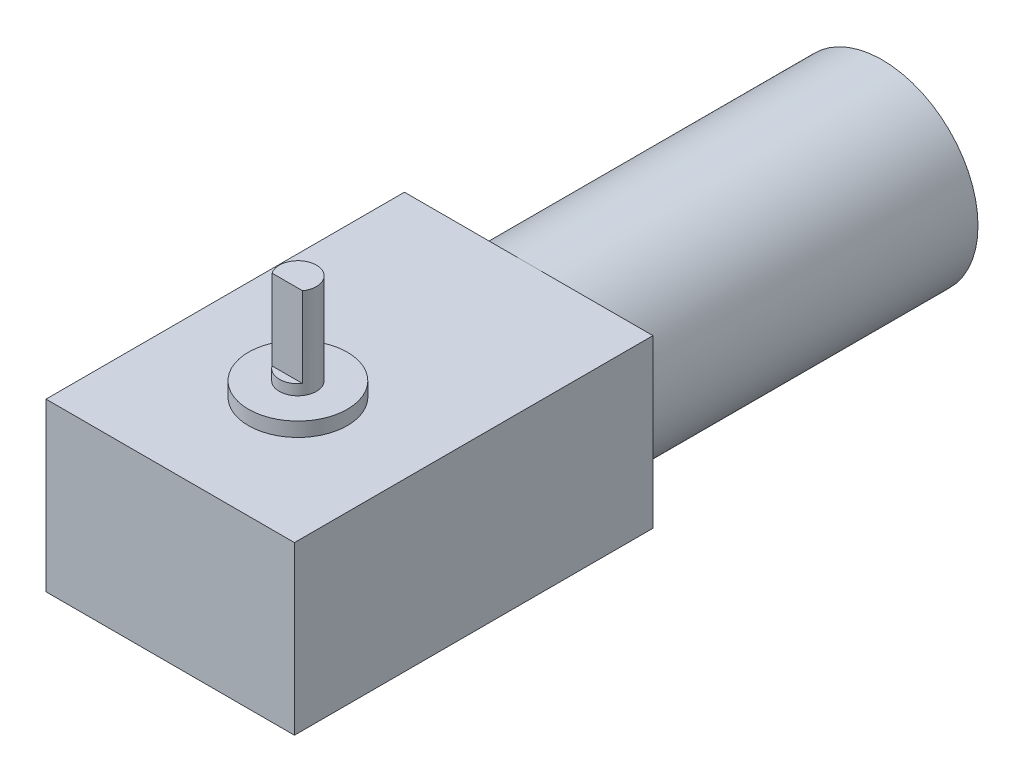
ISO-10303-21;
HEADER;
FILE_DESCRIPTION(('STEP AP214'),'2;1');
FILE_NAME('part.step','',(''),(''),'','','');
FILE_SCHEMA(('AUTOMOTIVE_DESIGN { 1 0 10303 214 1 1 1 1 }'));
ENDSEC;
DATA;
#1=APPLICATION_CONTEXT('core data for automotive mechanical design processes');
#2=APPLICATION_PROTOCOL_DEFINITION('international standard','automotive_design',2000,#1);
#3=PRODUCT_CONTEXT('',#1,'mechanical');
#4=PRODUCT('Part','Part','',(#3));
#5=PRODUCT_RELATED_PRODUCT_CATEGORY('part','',(#4));
#6=PRODUCT_DEFINITION_FORMATION('','',#4);
#7=PRODUCT_DEFINITION_CONTEXT('part definition',#1,'design');
#8=PRODUCT_DEFINITION('design','',#6,#7);
#9=PRODUCT_DEFINITION_SHAPE('','',#8);
#10=(LENGTH_UNIT() NAMED_UNIT(*) SI_UNIT(.MILLI.,.METRE.));
#11=(NAMED_UNIT(*) PLANE_ANGLE_UNIT() SI_UNIT($,.RADIAN.));
#12=(NAMED_UNIT(*) SI_UNIT($,.STERADIAN.) SOLID_ANGLE_UNIT());
#13=UNCERTAINTY_MEASURE_WITH_UNIT(LENGTH_MEASURE(1.E-05),#10,'distance_accuracy_value','');
#14=(GEOMETRIC_REPRESENTATION_CONTEXT(3) GLOBAL_UNCERTAINTY_ASSIGNED_CONTEXT((#13)) GLOBAL_UNIT_ASSIGNED_CONTEXT((#10,
#11,#12)) REPRESENTATION_CONTEXT('',''));
#15=CARTESIAN_POINT('',(0.,0.,0.));
#16=DIRECTION('',(0.,0.,1.));
#17=DIRECTION('',(1.,0.,0.));
#18=AXIS2_PLACEMENT_3D('',#15,#16,#17);
#19=CARTESIAN_POINT('',(0.,-11.5,115.2));
#20=DIRECTION('',(0.,1.,0.));
#21=DIRECTION('',(0.,0.,1.));
#22=AXIS2_PLACEMENT_3D('',#19,#20,#21);
#23=PLANE('',#22);
#24=CARTESIAN_POINT('',(-14.1,-11.5,66.2));
#25=DIRECTION('',(0.,1.,0.));
#26=DIRECTION('',(0.,0.,1.));
#27=AXIS2_PLACEMENT_3D('',#24,#25,#26);
#28=CIRCLE('',#27,3.5);
#29=CARTESIAN_POINT('',(-14.1,-11.5,69.7));
#30=VERTEX_POINT('',#29);
#31=EDGE_CURVE('E54',#30,#30,#28,.F.);
#32=ORIENTED_EDGE('',*,*,#31,.F.);
#33=EDGE_LOOP('',(#32));
#34=FACE_BOUND('',#33,.T.);
#35=CARTESIAN_POINT('',(14.1,-11.5,106.2));
#36=DIRECTION('',(0.,1.,0.));
#37=DIRECTION('',(0.,0.,1.));
#38=AXIS2_PLACEMENT_3D('',#35,#36,#37);
#39=CIRCLE('',#38,3.5);
#40=CARTESIAN_POINT('',(14.1,-11.5,109.7));
#41=VERTEX_POINT('',#40);
#42=EDGE_CURVE('E207',#41,#41,#39,.F.);
#43=ORIENTED_EDGE('',*,*,#42,.F.);
#44=EDGE_LOOP('',(#43));
#45=FACE_BOUND('',#44,.T.);
#46=CARTESIAN_POINT('',(0.,-11.5,95.2));
#47=DIRECTION('',(0.,1.,0.));
#48=DIRECTION('',(0.,0.,1.));
#49=AXIS2_PLACEMENT_3D('',#46,#47,#48);
#50=CIRCLE('',#49,9.25);
#51=CARTESIAN_POINT('',(0.,-11.5,104.45));
#52=VERTEX_POINT('',#51);
#53=EDGE_CURVE('E203',#52,#52,#50,.F.);
#54=ORIENTED_EDGE('',*,*,#53,.F.);
#55=EDGE_LOOP('',(#54));
#56=FACE_BOUND('',#55,.T.);
#57=DIRECTION('',(1.,0.,0.));
#58=VECTOR('',#57,1.);
#59=CARTESIAN_POINT('',(0.,-11.5,57.2));
#60=LINE('',#59,#58);
#61=CARTESIAN_POINT('',(-20.1,-11.5,57.2));
#62=VERTEX_POINT('',#61);
#63=CARTESIAN_POINT('',(-10.3923048454133,-11.5,57.2));
#64=VERTEX_POINT('',#63);
#65=EDGE_CURVE('E165',#62,#64,#60,.T.);
#66=ORIENTED_EDGE('',*,*,#65,.T.);
#67=CARTESIAN_POINT('',(10.3923048454133,-11.5,57.2));
#68=VERTEX_POINT('',#67);
#69=EDGE_CURVE('E68',#64,#68,#60,.T.);
#70=ORIENTED_EDGE('',*,*,#69,.T.);
#71=CARTESIAN_POINT('',(20.1,-11.5,57.2));
#72=VERTEX_POINT('',#71);
#73=EDGE_CURVE('E164',#68,#72,#60,.T.);
#74=ORIENTED_EDGE('',*,*,#73,.T.);
#75=DIRECTION('',(0.,0.,-1.));
#76=VECTOR('',#75,1.);
#77=CARTESIAN_POINT('',(20.1,-11.5,115.2));
#78=LINE('',#77,#76);
#79=CARTESIAN_POINT('',(20.1,-11.5,115.2));
#80=VERTEX_POINT('',#79);
#81=EDGE_CURVE('E183',#80,#72,#78,.T.);
#82=ORIENTED_EDGE('',*,*,#81,.F.);
#83=DIRECTION('',(1.,0.,0.));
#84=VECTOR('',#83,1.);
#85=CARTESIAN_POINT('',(0.,-11.5,115.2));
#86=LINE('',#85,#84);
#87=CARTESIAN_POINT('',(-20.1,-11.5,115.2));
#88=VERTEX_POINT('',#87);
#89=EDGE_CURVE('E148',#88,#80,#86,.T.);
#90=ORIENTED_EDGE('',*,*,#89,.F.);
#91=DIRECTION('',(0.,0.,-1.));
#92=VECTOR('',#91,1.);
#93=CARTESIAN_POINT('',(-20.1,-11.5,115.2));
#94=LINE('',#93,#92);
#95=EDGE_CURVE('E187',#88,#62,#94,.T.);
#96=ORIENTED_EDGE('',*,*,#95,.T.);
#97=EDGE_LOOP('',(#66,#70,#74,#82,#90,#96));
#98=FACE_BOUND('',#97,.T.);
#99=CARTESIAN_POINT('',(14.1,-11.5,66.2));
#100=DIRECTION('',(0.,1.,0.));
#101=DIRECTION('',(0.,0.,1.));
#102=AXIS2_PLACEMENT_3D('',#99,#100,#101);
#103=CIRCLE('',#102,3.5);
#104=CARTESIAN_POINT('',(14.1,-11.5,69.7));
#105=VERTEX_POINT('',#104);
#106=EDGE_CURVE('E211',#105,#105,#103,.F.);
#107=ORIENTED_EDGE('',*,*,#106,.F.);
#108=EDGE_LOOP('',(#107));
#109=FACE_BOUND('',#108,.T.);
#110=CARTESIAN_POINT('',(-14.1,-11.5,106.2));
#111=DIRECTION('',(0.,1.,0.));
#112=DIRECTION('',(0.,0.,1.));
#113=AXIS2_PLACEMENT_3D('',#110,#111,#112);
#114=CIRCLE('',#113,3.5);
#115=CARTESIAN_POINT('',(-14.1,-11.5,109.7));
#116=VERTEX_POINT('',#115);
#117=EDGE_CURVE('E11',#116,#116,#114,.F.);
#118=ORIENTED_EDGE('',*,*,#117,.F.);
#119=EDGE_LOOP('',(#118));
#120=FACE_BOUND('',#119,.T.);
#121=ADVANCED_FACE('F45',(#34,#45,#56,#98,#109,#120),#23,.F.);
#122=CARTESIAN_POINT('',(0.,0.,57.2));
#123=DIRECTION('',(0.,0.,-1.));
#124=DIRECTION('',(-1.,0.,0.));
#125=AXIS2_PLACEMENT_3D('',#122,#123,#124);
#126=CYLINDRICAL_SURFACE('',#125,15.5);
#127=CARTESIAN_POINT('',(0.,0.,57.2));
#128=DIRECTION('',(0.,0.,1.));
#129=DIRECTION('',(1.,0.,0.));
#130=AXIS2_PLACEMENT_3D('',#127,#128,#129);
#131=CIRCLE('',#130,15.5);
#132=CARTESIAN_POINT('',(0.,15.5,57.2));
#133=VERTEX_POINT('',#132);
#134=EDGE_CURVE('E192',#133,#64,#131,.T.);
#135=ORIENTED_EDGE('',*,*,#134,.F.);
#136=EDGE_CURVE('E197',#68,#133,#131,.T.);
#137=ORIENTED_EDGE('',*,*,#136,.F.);
#138=EDGE_CURVE('E196',#64,#68,#131,.T.);
#139=ORIENTED_EDGE('',*,*,#138,.F.);
#140=EDGE_LOOP('',(#135,#137,#139));
#141=FACE_BOUND('',#140,.T.);
#142=CARTESIAN_POINT('',(0.,0.,0.));
#143=DIRECTION('',(0.,0.,1.));
#144=DIRECTION('',(1.,0.,0.));
#145=AXIS2_PLACEMENT_3D('',#142,#143,#144);
#146=CIRCLE('',#145,15.5);
#147=CARTESIAN_POINT('',(15.5,0.,0.));
#148=VERTEX_POINT('',#147);
#149=EDGE_CURVE('E191',#148,#148,#146,.T.);
#150=ORIENTED_EDGE('',*,*,#149,.T.);
#151=EDGE_LOOP('',(#150));
#152=FACE_BOUND('',#151,.T.);
#153=ADVANCED_FACE('F47',(#141,#152),#126,.T.);
#154=CARTESIAN_POINT('',(0.,0.,57.2));
#155=DIRECTION('',(0.,0.,1.));
#156=DIRECTION('',(1.,0.,0.));
#157=AXIS2_PLACEMENT_3D('',#154,#155,#156);
#158=PLANE('',#157);
#159=ORIENTED_EDGE('',*,*,#69,.F.);
#160=ORIENTED_EDGE('',*,*,#138,.T.);
#161=EDGE_LOOP('',(#159,#160));
#162=FACE_BOUND('',#161,.T.);
#163=ADVANCED_FACE('F347',(#162),#158,.T.);
#164=CARTESIAN_POINT('',(0.,0.,0.));
#165=DIRECTION('',(0.,0.,1.));
#166=DIRECTION('',(1.,0.,0.));
#167=AXIS2_PLACEMENT_3D('',#164,#165,#166);
#168=PLANE('',#167);
#169=ORIENTED_EDGE('',*,*,#149,.F.);
#170=EDGE_LOOP('',(#169));
#171=FACE_BOUND('',#170,.T.);
#172=ADVANCED_FACE('F334',(#171),#168,.F.);
#173=CARTESIAN_POINT('',(0.,0.,57.2));
#174=DIRECTION('',(0.,0.,1.));
#175=DIRECTION('',(1.,0.,0.));
#176=AXIS2_PLACEMENT_3D('',#173,#174,#175);
#177=PLANE('',#176);
#178=DIRECTION('',(1.,0.,0.));
#179=VECTOR('',#178,1.);
#180=CARTESIAN_POINT('',(0.,15.5,57.2));
#181=LINE('',#180,#179);
#182=CARTESIAN_POINT('',(-20.1,15.5,57.2));
#183=VERTEX_POINT('',#182);
#184=EDGE_CURVE('E149',#183,#133,#181,.T.);
#185=ORIENTED_EDGE('',*,*,#184,.T.);
#186=ORIENTED_EDGE('',*,*,#134,.T.);
#187=ORIENTED_EDGE('',*,*,#65,.F.);
#188=DIRECTION('',(0.,-1.,0.));
#189=VECTOR('',#188,1.);
#190=CARTESIAN_POINT('',(-20.1,0.,57.2));
#191=LINE('',#190,#189);
#192=EDGE_CURVE('E142',#183,#62,#191,.T.);
#193=ORIENTED_EDGE('',*,*,#192,.F.);
#194=EDGE_LOOP('',(#185,#186,#187,#193));
#195=FACE_BOUND('',#194,.T.);
#196=ADVANCED_FACE('F330',(#195),#177,.F.);
#197=ORIENTED_EDGE('',*,*,#73,.F.);
#198=ORIENTED_EDGE('',*,*,#136,.T.);
#199=CARTESIAN_POINT('',(20.1,15.5,57.2));
#200=VERTEX_POINT('',#199);
#201=EDGE_CURVE('E173',#133,#200,#181,.T.);
#202=ORIENTED_EDGE('',*,*,#201,.T.);
#203=DIRECTION('',(0.,-1.,0.));
#204=VECTOR('',#203,1.);
#205=CARTESIAN_POINT('',(20.1,0.,57.2));
#206=LINE('',#205,#204);
#207=EDGE_CURVE('E169',#200,#72,#206,.T.);
#208=ORIENTED_EDGE('',*,*,#207,.T.);
#209=EDGE_LOOP('',(#197,#198,#202,#208));
#210=FACE_BOUND('',#209,.T.);
#211=ADVANCED_FACE('F333',(#210),#177,.F.);
#212=CARTESIAN_POINT('',(-20.1,0.,115.2));
#213=DIRECTION('',(1.,0.,0.));
#214=DIRECTION('',(0.,1.,0.));
#215=AXIS2_PLACEMENT_3D('',#212,#213,#214);
#216=PLANE('',#215);
#217=ORIENTED_EDGE('',*,*,#192,.T.);
#218=ORIENTED_EDGE('',*,*,#95,.F.);
#219=DIRECTION('',(0.,-1.,0.));
#220=VECTOR('',#219,1.);
#221=CARTESIAN_POINT('',(-20.1,0.,115.2));
#222=LINE('',#221,#220);
#223=CARTESIAN_POINT('',(-20.1,15.5,115.2));
#224=VERTEX_POINT('',#223);
#225=EDGE_CURVE('E144',#224,#88,#222,.T.);
#226=ORIENTED_EDGE('',*,*,#225,.F.);
#227=DIRECTION('',(0.,0.,-1.));
#228=VECTOR('',#227,1.);
#229=CARTESIAN_POINT('',(-20.1,15.5,115.2));
#230=LINE('',#229,#228);
#231=EDGE_CURVE('E160',#224,#183,#230,.T.);
#232=ORIENTED_EDGE('',*,*,#231,.T.);
#233=EDGE_LOOP('',(#217,#218,#226,#232));
#234=FACE_BOUND('',#233,.T.);
#235=ADVANCED_FACE('F341',(#234),#216,.F.);
#236=CARTESIAN_POINT('',(20.1,0.,115.2));
#237=DIRECTION('',(1.,0.,0.));
#238=DIRECTION('',(0.,1.,0.));
#239=AXIS2_PLACEMENT_3D('',#236,#237,#238);
#240=PLANE('',#239);
#241=ORIENTED_EDGE('',*,*,#207,.F.);
#242=DIRECTION('',(0.,0.,-1.));
#243=VECTOR('',#242,1.);
#244=CARTESIAN_POINT('',(20.1,15.5,115.2));
#245=LINE('',#244,#243);
#246=CARTESIAN_POINT('',(20.1,15.5,115.2));
#247=VERTEX_POINT('',#246);
#248=EDGE_CURVE('E179',#247,#200,#245,.T.);
#249=ORIENTED_EDGE('',*,*,#248,.F.);
#250=DIRECTION('',(0.,-1.,0.));
#251=VECTOR('',#250,1.);
#252=CARTESIAN_POINT('',(20.1,0.,115.2));
#253=LINE('',#252,#251);
#254=EDGE_CURVE('E152',#247,#80,#253,.T.);
#255=ORIENTED_EDGE('',*,*,#254,.T.);
#256=ORIENTED_EDGE('',*,*,#81,.T.);
#257=EDGE_LOOP('',(#241,#249,#255,#256));
#258=FACE_BOUND('',#257,.T.);
#259=ADVANCED_FACE('F338',(#258),#240,.T.);
#260=CARTESIAN_POINT('',(0.,15.5,115.2));
#261=DIRECTION('',(0.,1.,0.));
#262=DIRECTION('',(0.,0.,1.));
#263=AXIS2_PLACEMENT_3D('',#260,#261,#262);
#264=PLANE('',#263);
#265=CARTESIAN_POINT('',(0.,15.5,94.5405519584882));
#266=DIRECTION('',(0.,1.,0.));
#267=DIRECTION('',(0.,0.,1.));
#268=AXIS2_PLACEMENT_3D('',#265,#266,#267);
#269=CIRCLE('',#268,8.);
#270=CARTESIAN_POINT('',(0.,15.5,102.540551958488));
#271=VERTEX_POINT('',#270);
#272=EDGE_CURVE('E128',#271,#271,#269,.T.);
#273=ORIENTED_EDGE('',*,*,#272,.F.);
#274=EDGE_LOOP('',(#273));
#275=FACE_BOUND('',#274,.T.);
#276=ORIENTED_EDGE('',*,*,#184,.F.);
#277=ORIENTED_EDGE('',*,*,#231,.F.);
#278=DIRECTION('',(1.,0.,0.));
#279=VECTOR('',#278,1.);
#280=CARTESIAN_POINT('',(0.,15.5,115.2));
#281=LINE('',#280,#279);
#282=EDGE_CURVE('E156',#224,#247,#281,.T.);
#283=ORIENTED_EDGE('',*,*,#282,.T.);
#284=ORIENTED_EDGE('',*,*,#248,.T.);
#285=ORIENTED_EDGE('',*,*,#201,.F.);
#286=EDGE_LOOP('',(#276,#277,#283,#284,#285));
#287=FACE_BOUND('',#286,.T.);
#288=ADVANCED_FACE('F328',(#275,#287),#264,.T.);
#289=CARTESIAN_POINT('',(0.,0.,115.2));
#290=DIRECTION('',(0.,0.,1.));
#291=DIRECTION('',(1.,0.,0.));
#292=AXIS2_PLACEMENT_3D('',#289,#290,#291);
#293=PLANE('',#292);
#294=ORIENTED_EDGE('',*,*,#225,.T.);
#295=ORIENTED_EDGE('',*,*,#89,.T.);
#296=ORIENTED_EDGE('',*,*,#254,.F.);
#297=ORIENTED_EDGE('',*,*,#282,.F.);
#298=EDGE_LOOP('',(#294,#295,#296,#297));
#299=FACE_BOUND('',#298,.T.);
#300=ADVANCED_FACE('F324',(#299),#293,.T.);
#301=CARTESIAN_POINT('',(0.,17.8,94.5405519584882));
#302=DIRECTION('',(0.,-1.,0.));
#303=DIRECTION('',(0.,0.,-1.));
#304=AXIS2_PLACEMENT_3D('',#301,#302,#303);
#305=CYLINDRICAL_SURFACE('',#304,8.);
#306=CARTESIAN_POINT('',(0.,17.8,94.5405519584882));
#307=DIRECTION('',(0.,1.,0.));
#308=DIRECTION('',(0.,0.,1.));
#309=AXIS2_PLACEMENT_3D('',#306,#307,#308);
#310=CIRCLE('',#309,8.);
#311=CARTESIAN_POINT('',(0.,17.8,102.540551958488));
#312=VERTEX_POINT('',#311);
#313=EDGE_CURVE('E133',#312,#312,#310,.T.);
#314=ORIENTED_EDGE('',*,*,#313,.F.);
#315=EDGE_LOOP('',(#314));
#316=FACE_BOUND('',#315,.T.);
#317=ORIENTED_EDGE('',*,*,#272,.T.);
#318=EDGE_LOOP('',(#317));
#319=FACE_BOUND('',#318,.T.);
#320=ADVANCED_FACE('F320',(#316,#319),#305,.T.);
#321=CARTESIAN_POINT('',(0.,17.8,94.5405519584882));
#322=DIRECTION('',(0.,1.,0.));
#323=DIRECTION('',(0.,0.,1.));
#324=AXIS2_PLACEMENT_3D('',#321,#322,#323);
#325=PLANE('',#324);
#326=CARTESIAN_POINT('',(0.,17.8,94.5405519584882));
#327=DIRECTION('',(0.,1.,0.));
#328=DIRECTION('',(0.,0.,1.));
#329=AXIS2_PLACEMENT_3D('',#326,#327,#328);
#330=CIRCLE('',#329,3.);
#331=CARTESIAN_POINT('',(0.,17.8,97.5405519584882));
#332=VERTEX_POINT('',#331);
#333=EDGE_CURVE('E116',#332,#332,#330,.T.);
#334=ORIENTED_EDGE('',*,*,#333,.F.);
#335=EDGE_LOOP('',(#334));
#336=FACE_BOUND('',#335,.T.);
#337=ORIENTED_EDGE('',*,*,#313,.T.);
#338=EDGE_LOOP('',(#337));
#339=FACE_BOUND('',#338,.T.);
#340=ADVANCED_FACE('F317',(#336,#339),#325,.T.);
#341=CARTESIAN_POINT('',(0.,32.5,94.5405519584882));
#342=DIRECTION('',(0.,-1.,0.));
#343=DIRECTION('',(0.,0.,-1.));
#344=AXIS2_PLACEMENT_3D('',#341,#342,#343);
#345=CYLINDRICAL_SURFACE('',#344,3.);
#346=CARTESIAN_POINT('',(0.,32.5,94.5405519584882));
#347=DIRECTION('',(0.,1.,0.));
#348=DIRECTION('',(0.,0.,1.));
#349=AXIS2_PLACEMENT_3D('',#346,#347,#348);
#350=CIRCLE('',#349,3.);
#351=CARTESIAN_POINT('',(2.46082368507366,32.5,96.2564618602548));
#352=VERTEX_POINT('',#351);
#353=CARTESIAN_POINT('',(-2.46082368507366,32.5,96.2564618602548));
#354=VERTEX_POINT('',#353);
#355=EDGE_CURVE('E122',#352,#354,#350,.T.);
#356=ORIENTED_EDGE('',*,*,#355,.F.);
#357=DIRECTION('',(0.,-1.,0.));
#358=VECTOR('',#357,1.);
#359=CARTESIAN_POINT('',(2.46082368507366,32.5,96.2564618602548));
#360=LINE('',#359,#358);
#361=CARTESIAN_POINT('',(2.46082368507366,19.5,96.2564618602548));
#362=VERTEX_POINT('',#361);
#363=EDGE_CURVE('E61',#352,#362,#360,.T.);
#364=ORIENTED_EDGE('',*,*,#363,.T.);
#365=CARTESIAN_POINT('',(0.,19.5,94.5405519584882));
#366=DIRECTION('',(0.,-1.,0.));
#367=DIRECTION('',(0.,0.,-1.));
#368=AXIS2_PLACEMENT_3D('',#365,#366,#367);
#369=CIRCLE('',#368,3.);
#370=CARTESIAN_POINT('',(-2.46082368507366,19.5,96.2564618602548));
#371=VERTEX_POINT('',#370);
#372=EDGE_CURVE('E115',#362,#371,#369,.T.);
#373=ORIENTED_EDGE('',*,*,#372,.T.);
#374=DIRECTION('',(0.,-1.,0.));
#375=VECTOR('',#374,1.);
#376=CARTESIAN_POINT('',(-2.46082368507366,32.5,96.2564618602548));
#377=LINE('',#376,#375);
#378=EDGE_CURVE('E109',#371,#354,#377,.F.);
#379=ORIENTED_EDGE('',*,*,#378,.T.);
#380=EDGE_LOOP('',(#356,#364,#373,#379));
#381=FACE_BOUND('',#380,.T.);
#382=ORIENTED_EDGE('',*,*,#333,.T.);
#383=EDGE_LOOP('',(#382));
#384=FACE_BOUND('',#383,.T.);
#385=ADVANCED_FACE('F120',(#381,#384),#345,.T.);
#386=CARTESIAN_POINT('',(0.,32.5,94.5405519584882));
#387=DIRECTION('',(0.,1.,0.));
#388=DIRECTION('',(0.,0.,1.));
#389=AXIS2_PLACEMENT_3D('',#386,#387,#388);
#390=PLANE('',#389);
#391=DIRECTION('',(-1.,0.,0.));
#392=VECTOR('',#391,1.);
#393=CARTESIAN_POINT('',(0.,32.5,96.2564618602548));
#394=LINE('',#393,#392);
#395=EDGE_CURVE('E106',#352,#354,#394,.T.);
#396=ORIENTED_EDGE('',*,*,#395,.F.);
#397=ORIENTED_EDGE('',*,*,#355,.T.);
#398=EDGE_LOOP('',(#396,#397));
#399=FACE_BOUND('',#398,.T.);
#400=ADVANCED_FACE('F126',(#399),#390,.T.);
#401=CARTESIAN_POINT('',(0.,19.5,0.));
#402=DIRECTION('',(0.,-1.,0.));
#403=DIRECTION('',(0.,0.,-1.));
#404=AXIS2_PLACEMENT_3D('',#401,#402,#403);
#405=PLANE('',#404);
#406=DIRECTION('',(-1.,0.,0.));
#407=VECTOR('',#406,1.);
#408=CARTESIAN_POINT('',(-3.21787522908284,19.5,96.2564618602548));
#409=LINE('',#408,#407);
#410=EDGE_CURVE('E124',#362,#371,#409,.T.);
#411=ORIENTED_EDGE('',*,*,#410,.T.);
#412=ORIENTED_EDGE('',*,*,#372,.F.);
#413=EDGE_LOOP('',(#411,#412));
#414=FACE_BOUND('',#413,.T.);
#415=ADVANCED_FACE('F307',(#414),#405,.F.);
#416=CARTESIAN_POINT('',(-3.21787522908284,19.5,96.2564618602548));
#417=DIRECTION('',(0.,0.,-1.));
#418=DIRECTION('',(-1.,0.,0.));
#419=AXIS2_PLACEMENT_3D('',#416,#417,#418);
#420=PLANE('',#419);
#421=ORIENTED_EDGE('',*,*,#395,.T.);
#422=ORIENTED_EDGE('',*,*,#378,.F.);
#423=ORIENTED_EDGE('',*,*,#410,.F.);
#424=ORIENTED_EDGE('',*,*,#363,.F.);
#425=EDGE_LOOP('',(#421,#422,#423,#424));
#426=FACE_BOUND('',#425,.T.);
#427=ADVANCED_FACE('F108',(#426),#420,.F.);
#428=CARTESIAN_POINT('',(0.,-16.,95.2));
#429=DIRECTION('',(0.,1.,0.));
#430=DIRECTION('',(0.,0.,1.));
#431=AXIS2_PLACEMENT_3D('',#428,#429,#430);
#432=CYLINDRICAL_SURFACE('',#431,9.25);
#433=CARTESIAN_POINT('',(0.,-16.,95.2));
#434=DIRECTION('',(0.,-1.,0.));
#435=DIRECTION('',(0.,0.,-1.));
#436=AXIS2_PLACEMENT_3D('',#433,#434,#435);
#437=CIRCLE('',#436,9.25);
#438=CARTESIAN_POINT('',(0.,-16.,85.95));
#439=VERTEX_POINT('',#438);
#440=EDGE_CURVE('E625',#439,#439,#437,.T.);
#441=ORIENTED_EDGE('',*,*,#440,.F.);
#442=EDGE_LOOP('',(#441));
#443=FACE_BOUND('',#442,.T.);
#444=ORIENTED_EDGE('',*,*,#53,.T.);
#445=EDGE_LOOP('',(#444));
#446=FACE_BOUND('',#445,.T.);
#447=ADVANCED_FACE('F282',(#443,#446),#432,.T.);
#448=CARTESIAN_POINT('',(0.,-16.,95.2));
#449=DIRECTION('',(0.,-1.,0.));
#450=DIRECTION('',(0.,0.,-1.));
#451=AXIS2_PLACEMENT_3D('',#448,#449,#450);
#452=PLANE('',#451);
#453=ORIENTED_EDGE('',*,*,#440,.T.);
#454=EDGE_LOOP('',(#453));
#455=FACE_BOUND('',#454,.T.);
#456=ADVANCED_FACE('F274',(#455),#452,.T.);
#457=CARTESIAN_POINT('',(14.1,-13.5,106.2));
#458=DIRECTION('',(0.,-1.,0.));
#459=DIRECTION('',(0.,0.,-1.));
#460=AXIS2_PLACEMENT_3D('',#457,#458,#459);
#461=PLANE('',#460);
#462=CARTESIAN_POINT('',(14.1,-13.5,106.2));
#463=DIRECTION('',(0.,-1.,0.));
#464=DIRECTION('',(0.,0.,-1.));
#465=AXIS2_PLACEMENT_3D('',#462,#463,#464);
#466=CIRCLE('',#465,3.5);
#467=CARTESIAN_POINT('',(14.1,-13.5,102.7));
#468=VERTEX_POINT('',#467);
#469=EDGE_CURVE('E635',#468,#468,#466,.T.);
#470=ORIENTED_EDGE('',*,*,#469,.T.);
#471=EDGE_LOOP('',(#470));
#472=FACE_BOUND('',#471,.T.);
#473=CARTESIAN_POINT('',(14.1,-13.5,106.2));
#474=DIRECTION('',(0.,-1.,0.));
#475=DIRECTION('',(0.,0.,-1.));
#476=AXIS2_PLACEMENT_3D('',#473,#474,#475);
#477=CIRCLE('',#476,2.);
#478=CARTESIAN_POINT('',(14.1,-13.5,104.2));
#479=VERTEX_POINT('',#478);
#480=EDGE_CURVE('E639',#479,#479,#477,.T.);
#481=ORIENTED_EDGE('',*,*,#480,.F.);
#482=EDGE_LOOP('',(#481));
#483=FACE_BOUND('',#482,.T.);
#484=ADVANCED_FACE('F270',(#472,#483),#461,.T.);
#485=CARTESIAN_POINT('',(14.1,-13.5,106.2));
#486=DIRECTION('',(0.,1.,0.));
#487=DIRECTION('',(0.,0.,1.));
#488=AXIS2_PLACEMENT_3D('',#485,#486,#487);
#489=CYLINDRICAL_SURFACE('',#488,3.5);
#490=ORIENTED_EDGE('',*,*,#469,.F.);
#491=EDGE_LOOP('',(#490));
#492=FACE_BOUND('',#491,.T.);
#493=ORIENTED_EDGE('',*,*,#42,.T.);
#494=EDGE_LOOP('',(#493));
#495=FACE_BOUND('',#494,.T.);
#496=ADVANCED_FACE('F273',(#492,#495),#489,.T.);
#497=CARTESIAN_POINT('',(14.1,-4.5,106.2));
#498=DIRECTION('',(0.,-1.,0.));
#499=DIRECTION('',(0.,0.,-1.));
#500=AXIS2_PLACEMENT_3D('',#497,#498,#499);
#501=PLANE('',#500);
#502=CARTESIAN_POINT('',(14.1,-4.5,106.2));
#503=DIRECTION('',(0.,-1.,0.));
#504=DIRECTION('',(0.,0.,-1.));
#505=AXIS2_PLACEMENT_3D('',#502,#503,#504);
#506=CIRCLE('',#505,2.);
#507=CARTESIAN_POINT('',(14.1,-4.5,104.2));
#508=VERTEX_POINT('',#507);
#509=EDGE_CURVE('E613',#508,#508,#506,.T.);
#510=ORIENTED_EDGE('',*,*,#509,.T.);
#511=EDGE_LOOP('',(#510));
#512=FACE_BOUND('',#511,.T.);
#513=ADVANCED_FACE('F278',(#512),#501,.T.);
#514=CARTESIAN_POINT('',(14.1,-4.5,106.2));
#515=DIRECTION('',(0.,-1.,0.));
#516=DIRECTION('',(0.,0.,-1.));
#517=AXIS2_PLACEMENT_3D('',#514,#515,#516);
#518=CYLINDRICAL_SURFACE('',#517,2.);
#519=ORIENTED_EDGE('',*,*,#509,.F.);
#520=EDGE_LOOP('',(#519));
#521=FACE_BOUND('',#520,.T.);
#522=ORIENTED_EDGE('',*,*,#480,.T.);
#523=EDGE_LOOP('',(#522));
#524=FACE_BOUND('',#523,.T.);
#525=ADVANCED_FACE('F268',(#521,#524),#518,.F.);
#526=CARTESIAN_POINT('',(14.1,-13.5,66.2));
#527=DIRECTION('',(0.,-1.,0.));
#528=DIRECTION('',(0.,0.,-1.));
#529=AXIS2_PLACEMENT_3D('',#526,#527,#528);
#530=PLANE('',#529);
#531=CARTESIAN_POINT('',(14.1,-13.5,66.2));
#532=DIRECTION('',(0.,-1.,0.));
#533=DIRECTION('',(0.,0.,-1.));
#534=AXIS2_PLACEMENT_3D('',#531,#532,#533);
#535=CIRCLE('',#534,3.5);
#536=CARTESIAN_POINT('',(14.1,-13.5,62.7));
#537=VERTEX_POINT('',#536);
#538=EDGE_CURVE('E647',#537,#537,#535,.T.);
#539=ORIENTED_EDGE('',*,*,#538,.T.);
#540=EDGE_LOOP('',(#539));
#541=FACE_BOUND('',#540,.T.);
#542=CARTESIAN_POINT('',(14.1,-13.5,66.2));
#543=DIRECTION('',(0.,-1.,0.));
#544=DIRECTION('',(0.,0.,-1.));
#545=AXIS2_PLACEMENT_3D('',#542,#543,#544);
#546=CIRCLE('',#545,2.);
#547=CARTESIAN_POINT('',(14.1,-13.5,64.2));
#548=VERTEX_POINT('',#547);
#549=EDGE_CURVE('E643',#548,#548,#546,.T.);
#550=ORIENTED_EDGE('',*,*,#549,.F.);
#551=EDGE_LOOP('',(#550));
#552=FACE_BOUND('',#551,.T.);
#553=ADVANCED_FACE('F264',(#541,#552),#530,.T.);
#554=CARTESIAN_POINT('',(14.1,-13.5,66.2));
#555=DIRECTION('',(0.,1.,0.));
#556=DIRECTION('',(0.,0.,1.));
#557=AXIS2_PLACEMENT_3D('',#554,#555,#556);
#558=CYLINDRICAL_SURFACE('',#557,3.5);
#559=ORIENTED_EDGE('',*,*,#538,.F.);
#560=EDGE_LOOP('',(#559));
#561=FACE_BOUND('',#560,.T.);
#562=ORIENTED_EDGE('',*,*,#106,.T.);
#563=EDGE_LOOP('',(#562));
#564=FACE_BOUND('',#563,.T.);
#565=ADVANCED_FACE('F260',(#561,#564),#558,.T.);
#566=CARTESIAN_POINT('',(14.1,-4.5,66.2));
#567=DIRECTION('',(0.,1.,0.));
#568=DIRECTION('',(0.,0.,1.));
#569=AXIS2_PLACEMENT_3D('',#566,#567,#568);
#570=PLANE('',#569);
#571=CARTESIAN_POINT('',(14.1,-4.5,66.2));
#572=DIRECTION('',(0.,-1.,0.));
#573=DIRECTION('',(0.,0.,1.));
#574=AXIS2_PLACEMENT_3D('',#571,#572,#573);
#575=CIRCLE('',#574,2.);
#576=CARTESIAN_POINT('',(14.1,-4.5,68.2));
#577=VERTEX_POINT('',#576);
#578=EDGE_CURVE('E617',#577,#577,#575,.T.);
#579=ORIENTED_EDGE('',*,*,#578,.T.);
#580=EDGE_LOOP('',(#579));
#581=FACE_BOUND('',#580,.T.);
#582=ADVANCED_FACE('F263',(#581),#570,.F.);
#583=CARTESIAN_POINT('',(14.1,-4.5,66.2));
#584=DIRECTION('',(0.,-1.,0.));
#585=DIRECTION('',(0.,0.,-1.));
#586=AXIS2_PLACEMENT_3D('',#583,#584,#585);
#587=CYLINDRICAL_SURFACE('',#586,2.);
#588=ORIENTED_EDGE('',*,*,#578,.F.);
#589=EDGE_LOOP('',(#588));
#590=FACE_BOUND('',#589,.T.);
#591=ORIENTED_EDGE('',*,*,#549,.T.);
#592=EDGE_LOOP('',(#591));
#593=FACE_BOUND('',#592,.T.);
#594=ADVANCED_FACE('F258',(#590,#593),#587,.F.);
#595=CARTESIAN_POINT('',(-14.1,-13.5,66.2));
#596=DIRECTION('',(0.,-1.,0.));
#597=DIRECTION('',(0.,0.,-1.));
#598=AXIS2_PLACEMENT_3D('',#595,#596,#597);
#599=PLANE('',#598);
#600=CARTESIAN_POINT('',(-14.1,-13.5,66.2));
#601=DIRECTION('',(0.,-1.,0.));
#602=DIRECTION('',(0.,0.,-1.));
#603=AXIS2_PLACEMENT_3D('',#600,#601,#602);
#604=CIRCLE('',#603,3.5);
#605=CARTESIAN_POINT('',(-14.1,-13.5,62.7));
#606=VERTEX_POINT('',#605);
#607=EDGE_CURVE('E655',#606,#606,#604,.T.);
#608=ORIENTED_EDGE('',*,*,#607,.T.);
#609=EDGE_LOOP('',(#608));
#610=FACE_BOUND('',#609,.T.);
#611=CARTESIAN_POINT('',(-14.1,-13.5,66.2));
#612=DIRECTION('',(0.,-1.,0.));
#613=DIRECTION('',(0.,0.,-1.));
#614=AXIS2_PLACEMENT_3D('',#611,#612,#613);
#615=CIRCLE('',#614,2.);
#616=CARTESIAN_POINT('',(-14.1,-13.5,64.2));
#617=VERTEX_POINT('',#616);
#618=EDGE_CURVE('E651',#617,#617,#615,.T.);
#619=ORIENTED_EDGE('',*,*,#618,.F.);
#620=EDGE_LOOP('',(#619));
#621=FACE_BOUND('',#620,.T.);
#622=ADVANCED_FACE('F254',(#610,#621),#599,.T.);
#623=CARTESIAN_POINT('',(-14.1,-13.5,66.2));
#624=DIRECTION('',(0.,1.,0.));
#625=DIRECTION('',(0.,0.,1.));
#626=AXIS2_PLACEMENT_3D('',#623,#624,#625);
#627=CYLINDRICAL_SURFACE('',#626,3.5);
#628=ORIENTED_EDGE('',*,*,#607,.F.);
#629=EDGE_LOOP('',(#628));
#630=FACE_BOUND('',#629,.T.);
#631=ORIENTED_EDGE('',*,*,#31,.T.);
#632=EDGE_LOOP('',(#631));
#633=FACE_BOUND('',#632,.T.);
#634=ADVANCED_FACE('F218',(#630,#633),#627,.T.);
#635=CARTESIAN_POINT('',(-14.1,-4.5,66.2));
#636=DIRECTION('',(0.,-1.,0.));
#637=DIRECTION('',(0.,0.,-1.));
#638=AXIS2_PLACEMENT_3D('',#635,#636,#637);
#639=PLANE('',#638);
#640=CARTESIAN_POINT('',(-14.1,-4.5,66.2));
#641=DIRECTION('',(0.,-1.,0.));
#642=DIRECTION('',(0.,0.,-1.));
#643=AXIS2_PLACEMENT_3D('',#640,#641,#642);
#644=CIRCLE('',#643,2.);
#645=CARTESIAN_POINT('',(-14.1,-4.5,64.2));
#646=VERTEX_POINT('',#645);
#647=EDGE_CURVE('E624',#646,#646,#644,.T.);
#648=ORIENTED_EDGE('',*,*,#647,.T.);
#649=EDGE_LOOP('',(#648));
#650=FACE_BOUND('',#649,.T.);
#651=ADVANCED_FACE('F253',(#650),#639,.T.);
#652=CARTESIAN_POINT('',(-14.1,-4.5,66.2));
#653=DIRECTION('',(0.,-1.,0.));
#654=DIRECTION('',(0.,0.,-1.));
#655=AXIS2_PLACEMENT_3D('',#652,#653,#654);
#656=CYLINDRICAL_SURFACE('',#655,2.);
#657=ORIENTED_EDGE('',*,*,#647,.F.);
#658=EDGE_LOOP('',(#657));
#659=FACE_BOUND('',#658,.T.);
#660=ORIENTED_EDGE('',*,*,#618,.T.);
#661=EDGE_LOOP('',(#660));
#662=FACE_BOUND('',#661,.T.);
#663=ADVANCED_FACE('F246',(#659,#662),#656,.F.);
#664=CARTESIAN_POINT('',(-14.1,-13.5,106.2));
#665=DIRECTION('',(0.,-1.,0.));
#666=DIRECTION('',(0.,0.,-1.));
#667=AXIS2_PLACEMENT_3D('',#664,#665,#666);
#668=PLANE('',#667);
#669=CARTESIAN_POINT('',(-14.1,-13.5,106.2));
#670=DIRECTION('',(0.,-1.,0.));
#671=DIRECTION('',(0.,0.,-1.));
#672=AXIS2_PLACEMENT_3D('',#669,#670,#671);
#673=CIRCLE('',#672,3.5);
#674=CARTESIAN_POINT('',(-14.1,-13.5,102.7));
#675=VERTEX_POINT('',#674);
#676=EDGE_CURVE('E663',#675,#675,#673,.T.);
#677=ORIENTED_EDGE('',*,*,#676,.T.);
#678=EDGE_LOOP('',(#677));
#679=FACE_BOUND('',#678,.T.);
#680=CARTESIAN_POINT('',(-14.1,-13.5,106.2));
#681=DIRECTION('',(0.,-1.,0.));
#682=DIRECTION('',(0.,0.,-1.));
#683=AXIS2_PLACEMENT_3D('',#680,#681,#682);
#684=CIRCLE('',#683,2.);
#685=CARTESIAN_POINT('',(-14.1,-13.5,104.2));
#686=VERTEX_POINT('',#685);
#687=EDGE_CURVE('E659',#686,#686,#684,.T.);
#688=ORIENTED_EDGE('',*,*,#687,.F.);
#689=EDGE_LOOP('',(#688));
#690=FACE_BOUND('',#689,.T.);
#691=ADVANCED_FACE('F235',(#679,#690),#668,.T.);
#692=CARTESIAN_POINT('',(-14.1,-13.5,106.2));
#693=DIRECTION('',(0.,1.,0.));
#694=DIRECTION('',(0.,0.,1.));
#695=AXIS2_PLACEMENT_3D('',#692,#693,#694);
#696=CYLINDRICAL_SURFACE('',#695,3.5);
#697=ORIENTED_EDGE('',*,*,#676,.F.);
#698=EDGE_LOOP('',(#697));
#699=FACE_BOUND('',#698,.T.);
#700=ORIENTED_EDGE('',*,*,#117,.T.);
#701=EDGE_LOOP('',(#700));
#702=FACE_BOUND('',#701,.T.);
#703=ADVANCED_FACE('F232',(#699,#702),#696,.T.);
#704=CARTESIAN_POINT('',(-14.1,-4.5,106.2));
#705=DIRECTION('',(0.,1.,0.));
#706=DIRECTION('',(0.,0.,1.));
#707=AXIS2_PLACEMENT_3D('',#704,#705,#706);
#708=PLANE('',#707);
#709=CARTESIAN_POINT('',(-14.1,-4.5,106.2));
#710=DIRECTION('',(0.,-1.,0.));
#711=DIRECTION('',(0.,0.,1.));
#712=AXIS2_PLACEMENT_3D('',#709,#710,#711);
#713=CIRCLE('',#712,2.);
#714=CARTESIAN_POINT('',(-14.1,-4.5,108.2));
#715=VERTEX_POINT('',#714);
#716=EDGE_CURVE('E620',#715,#715,#713,.T.);
#717=ORIENTED_EDGE('',*,*,#716,.T.);
#718=EDGE_LOOP('',(#717));
#719=FACE_BOUND('',#718,.T.);
#720=ADVANCED_FACE('F234',(#719),#708,.F.);
#721=CARTESIAN_POINT('',(-14.1,-4.5,106.2));
#722=DIRECTION('',(0.,-1.,0.));
#723=DIRECTION('',(0.,0.,-1.));
#724=AXIS2_PLACEMENT_3D('',#721,#722,#723);
#725=CYLINDRICAL_SURFACE('',#724,2.);
#726=ORIENTED_EDGE('',*,*,#716,.F.);
#727=EDGE_LOOP('',(#726));
#728=FACE_BOUND('',#727,.T.);
#729=ORIENTED_EDGE('',*,*,#687,.T.);
#730=EDGE_LOOP('',(#729));
#731=FACE_BOUND('',#730,.T.);
#732=ADVANCED_FACE('F243',(#728,#731),#725,.F.);
#733=CLOSED_SHELL('',(#121,#153,#163,#172,#196,#211,#235,#259,#288,#300,#320,#340,#385,#400,
#415,#427,#447,#456,#484,#496,#513,#525,#553,#565,#582,#594,#622,#634,#651,#663,#691,#703,#720,#732));
#734=MANIFOLD_SOLID_BREP('B2',#733);
#735=ADVANCED_BREP_SHAPE_REPRESENTATION('',(#18,#734),#14);
#736=SHAPE_DEFINITION_REPRESENTATION(#9,#735);
ENDSEC;
END-ISO-10303-21;
